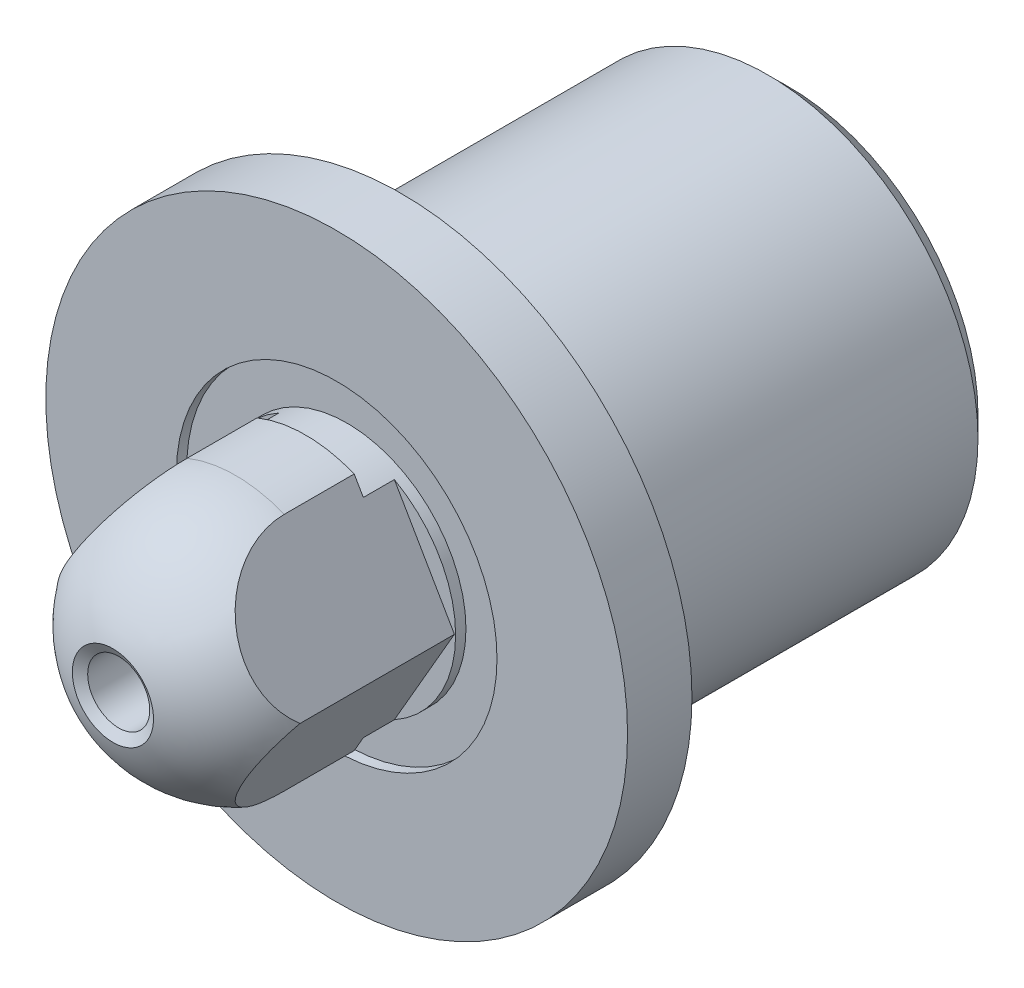
ISO-10303-21;
HEADER;
FILE_DESCRIPTION(('STEP AP214'),'2;1');
FILE_NAME('part.step','',(''),(''),'','','');
FILE_SCHEMA(('AUTOMOTIVE_DESIGN { 1 0 10303 214 1 1 1 1 }'));
ENDSEC;
DATA;
#1=APPLICATION_CONTEXT('core data for automotive mechanical design processes');
#2=APPLICATION_PROTOCOL_DEFINITION('international standard','automotive_design',2000,#1);
#3=PRODUCT_CONTEXT('',#1,'mechanical');
#4=PRODUCT('Part','Part','',(#3));
#5=PRODUCT_RELATED_PRODUCT_CATEGORY('part','',(#4));
#6=PRODUCT_DEFINITION_FORMATION('','',#4);
#7=PRODUCT_DEFINITION_CONTEXT('part definition',#1,'design');
#8=PRODUCT_DEFINITION('design','',#6,#7);
#9=PRODUCT_DEFINITION_SHAPE('','',#8);
#10=(LENGTH_UNIT() NAMED_UNIT(*) SI_UNIT(.MILLI.,.METRE.));
#11=(NAMED_UNIT(*) PLANE_ANGLE_UNIT() SI_UNIT($,.RADIAN.));
#12=(NAMED_UNIT(*) SI_UNIT($,.STERADIAN.) SOLID_ANGLE_UNIT());
#13=UNCERTAINTY_MEASURE_WITH_UNIT(LENGTH_MEASURE(1.E-05),#10,'distance_accuracy_value','');
#14=(GEOMETRIC_REPRESENTATION_CONTEXT(3) GLOBAL_UNCERTAINTY_ASSIGNED_CONTEXT((#13)) GLOBAL_UNIT_ASSIGNED_CONTEXT((#10,
#11,#12)) REPRESENTATION_CONTEXT('',''));
#15=CARTESIAN_POINT('',(0.,0.,0.));
#16=DIRECTION('',(0.,0.,1.));
#17=DIRECTION('',(1.,0.,0.));
#18=AXIS2_PLACEMENT_3D('',#15,#16,#17);
#19=CARTESIAN_POINT('',(0.,0.,13.586546080724));
#20=DIRECTION('',(0.,0.,1.));
#21=DIRECTION('',(0.,1.,0.));
#22=AXIS2_PLACEMENT_3D('',#19,#20,#21);
#23=SPHERICAL_SURFACE('',#22,3.17500000000001);
#24=CARTESIAN_POINT('',(0.,0.,16.6008963569466));
#25=DIRECTION('',(0.,0.,-1.));
#26=DIRECTION('',(-1.,0.,0.));
#27=AXIS2_PLACEMENT_3D('',#24,#25,#26);
#28=CIRCLE('',#27,0.997154658133342);
#29=CARTESIAN_POINT('',(-0.997154658133342,0.,16.6008963569466));
#30=VERTEX_POINT('',#29);
#31=EDGE_CURVE('E229',#30,#30,#28,.T.);
#32=ORIENTED_EDGE('',*,*,#31,.T.);
#33=EDGE_LOOP('',(#32));
#34=FACE_BOUND('',#33,.T.);
#35=CARTESIAN_POINT('',(-2.1685653285078,-1.25202177616928,13.586546080724));
#36=DIRECTION('',(-0.866025403784436,-0.500000000000004,0.));
#37=DIRECTION('',(0.500000000000004,-0.866025403784436,0.));
#38=AXIS2_PLACEMENT_3D('',#35,#36,#37);
#39=CIRCLE('',#38,1.95202225601857);
#40=CARTESIAN_POINT('',(-1.19255420049851,-2.94252263863396,13.586546080724));
#41=VERTEX_POINT('',#40);
#42=CARTESIAN_POINT('',(-2.89142043801042,0.,14.8981530533556));
#43=VERTEX_POINT('',#42);
#44=EDGE_CURVE('E134',#41,#43,#39,.T.);
#45=ORIENTED_EDGE('',*,*,#44,.F.);
#46=CARTESIAN_POINT('',(0.,0.,13.586546080724));
#47=DIRECTION('',(0.,0.,1.));
#48=DIRECTION('',(1.,0.,0.));
#49=AXIS2_PLACEMENT_3D('',#46,#47,#48);
#50=CIRCLE('',#49,3.175);
#51=CARTESIAN_POINT('',(1.19255420049851,-2.94252263863396,13.586546080724));
#52=VERTEX_POINT('',#51);
#53=EDGE_CURVE('E50',#41,#52,#50,.T.);
#54=ORIENTED_EDGE('',*,*,#53,.T.);
#55=CARTESIAN_POINT('',(2.1685653285078,-1.25202177616928,13.586546080724));
#56=DIRECTION('',(0.866025403784436,-0.500000000000004,0.));
#57=DIRECTION('',(0.500000000000004,0.866025403784437,0.));
#58=AXIS2_PLACEMENT_3D('',#55,#56,#57);
#59=CIRCLE('',#58,1.95202225601857);
#60=CARTESIAN_POINT('',(2.89142043801041,0.,14.8981530533556));
#61=VERTEX_POINT('',#60);
#62=EDGE_CURVE('E144',#61,#52,#59,.T.);
#63=ORIENTED_EDGE('',*,*,#62,.F.);
#64=CARTESIAN_POINT('',(2.1685653285078,1.25202177616928,13.586546080724));
#65=DIRECTION('',(0.866025403784436,0.500000000000004,0.));
#66=DIRECTION('',(-0.500000000000004,0.866025403784436,0.));
#67=AXIS2_PLACEMENT_3D('',#64,#65,#66);
#68=CIRCLE('',#67,1.95202225601857);
#69=CARTESIAN_POINT('',(1.19255420049851,2.94252263863396,13.586546080724));
#70=VERTEX_POINT('',#69);
#71=EDGE_CURVE('E153',#70,#61,#68,.T.);
#72=ORIENTED_EDGE('',*,*,#71,.F.);
#73=CARTESIAN_POINT('',(-1.19255420049851,2.94252263863396,13.586546080724));
#74=VERTEX_POINT('',#73);
#75=EDGE_CURVE('E57',#70,#74,#50,.T.);
#76=ORIENTED_EDGE('',*,*,#75,.T.);
#77=CARTESIAN_POINT('',(-2.1685653285078,1.25202177616928,13.586546080724));
#78=DIRECTION('',(-0.866025403784436,0.500000000000004,0.));
#79=DIRECTION('',(-0.500000000000004,-0.866025403784436,0.));
#80=AXIS2_PLACEMENT_3D('',#77,#78,#79);
#81=CIRCLE('',#80,1.95202225601857);
#82=EDGE_CURVE('E161',#43,#74,#81,.T.);
#83=ORIENTED_EDGE('',*,*,#82,.F.);
#84=EDGE_LOOP('',(#45,#54,#63,#72,#76,#83));
#85=FACE_BOUND('',#84,.T.);
#86=ADVANCED_FACE('F35',(#34,#85),#23,.T.);
#87=CARTESIAN_POINT('',(0.,2.921,11.86815));
#88=DIRECTION('',(0.,0.,-1.));
#89=DIRECTION('',(-1.,0.,0.));
#90=AXIS2_PLACEMENT_3D('',#87,#88,#89);
#91=PLANE('',#90);
#92=CARTESIAN_POINT('',(0.,0.,11.86815));
#93=DIRECTION('',(0.,0.,-1.));
#94=DIRECTION('',(-1.,0.,0.));
#95=AXIS2_PLACEMENT_3D('',#92,#93,#94);
#96=CIRCLE('',#95,3.175);
#97=CARTESIAN_POINT('',(1.19255420049851,-2.94252263863396,11.86815));
#98=VERTEX_POINT('',#97);
#99=CARTESIAN_POINT('',(-1.19255420049851,-2.94252263863396,11.86815));
#100=VERTEX_POINT('',#99);
#101=EDGE_CURVE('E196',#98,#100,#96,.T.);
#102=ORIENTED_EDGE('',*,*,#101,.T.);
#103=DIRECTION('',(-0.500000000000004,0.866025403784436,0.));
#104=VECTOR('',#103,1.);
#105=CARTESIAN_POINT('',(-3.43339543073498,0.938728223830708,11.86815));
#106=LINE('',#105,#104);
#107=CARTESIAN_POINT('',(-1.41656684313835,-2.554521360044,11.86815));
#108=VERTEX_POINT('',#107);
#109=EDGE_CURVE('E164',#100,#108,#106,.T.);
#110=ORIENTED_EDGE('',*,*,#109,.T.);
#111=CARTESIAN_POINT('',(0.,0.,11.86815));
#112=DIRECTION('',(0.,0.,1.));
#113=DIRECTION('',(1.,0.,0.));
#114=AXIS2_PLACEMENT_3D('',#111,#112,#113);
#115=CIRCLE('',#114,2.921);
#116=CARTESIAN_POINT('',(1.41656684313835,-2.554521360044,11.86815));
#117=VERTEX_POINT('',#116);
#118=EDGE_CURVE('E190',#108,#117,#115,.T.);
#119=ORIENTED_EDGE('',*,*,#118,.T.);
#120=DIRECTION('',(-0.500000000000004,-0.866025403784437,0.));
#121=VECTOR('',#120,1.);
#122=CARTESIAN_POINT('',(3.43339543073498,0.938728223830709,11.86815));
#123=LINE('',#122,#121);
#124=EDGE_CURVE('E141',#117,#98,#123,.T.);
#125=ORIENTED_EDGE('',*,*,#124,.T.);
#126=EDGE_LOOP('',(#102,#110,#119,#125));
#127=FACE_BOUND('',#126,.T.);
#128=ADVANCED_FACE('F247',(#127),#91,.T.);
#129=CARTESIAN_POINT('',(1.41656684313835,2.554521360044,11.86815));
#130=VERTEX_POINT('',#129);
#131=CARTESIAN_POINT('',(-1.41656684313835,2.554521360044,11.86815));
#132=VERTEX_POINT('',#131);
#133=EDGE_CURVE('E186',#130,#132,#115,.T.);
#134=ORIENTED_EDGE('',*,*,#133,.T.);
#135=DIRECTION('',(0.500000000000004,0.866025403784436,0.));
#136=VECTOR('',#135,1.);
#137=CARTESIAN_POINT('',(-0.90373522628062,3.44277177616927,11.86815));
#138=LINE('',#137,#136);
#139=CARTESIAN_POINT('',(-1.19255420049851,2.94252263863396,11.86815));
#140=VERTEX_POINT('',#139);
#141=EDGE_CURVE('E158',#132,#140,#138,.T.);
#142=ORIENTED_EDGE('',*,*,#141,.T.);
#143=CARTESIAN_POINT('',(1.19255420049851,2.94252263863396,11.86815));
#144=VERTEX_POINT('',#143);
#145=EDGE_CURVE('E205',#140,#144,#96,.T.);
#146=ORIENTED_EDGE('',*,*,#145,.T.);
#147=DIRECTION('',(0.500000000000004,-0.866025403784436,0.));
#148=VECTOR('',#147,1.);
#149=CARTESIAN_POINT('',(0.90373522628062,3.44277177616927,11.86815));
#150=LINE('',#149,#148);
#151=EDGE_CURVE('E150',#144,#130,#150,.T.);
#152=ORIENTED_EDGE('',*,*,#151,.T.);
#153=EDGE_LOOP('',(#134,#142,#146,#152));
#154=FACE_BOUND('',#153,.T.);
#155=ADVANCED_FACE('F263',(#154),#91,.T.);
#156=CARTESIAN_POINT('',(0.,0.,17.3335052900337));
#157=DIRECTION('',(0.,0.,1.));
#158=DIRECTION('',(1.,0.,0.));
#159=AXIS2_PLACEMENT_3D('',#156,#157,#158);
#160=CYLINDRICAL_SURFACE('',#159,2.921);
#161=CARTESIAN_POINT('',(0.,0.,10.85215));
#162=DIRECTION('',(0.,0.,1.));
#163=DIRECTION('',(1.,0.,0.));
#164=AXIS2_PLACEMENT_3D('',#161,#162,#163);
#165=CIRCLE('',#164,2.921);
#166=CARTESIAN_POINT('',(2.921,0.,10.85215));
#167=VERTEX_POINT('',#166);
#168=EDGE_CURVE('E189',#167,#167,#165,.T.);
#169=ORIENTED_EDGE('',*,*,#168,.T.);
#170=EDGE_LOOP('',(#169));
#171=FACE_BOUND('',#170,.T.);
#172=ORIENTED_EDGE('',*,*,#133,.F.);
#173=DIRECTION('',(0.,0.,1.));
#174=VECTOR('',#173,1.);
#175=CARTESIAN_POINT('',(1.41656684313835,2.554521360044,17.3335052900337));
#176=LINE('',#175,#174);
#177=CARTESIAN_POINT('',(1.41656684313835,2.554521360044,11.10615));
#178=VERTEX_POINT('',#177);
#179=EDGE_CURVE('E155',#130,#178,#176,.F.);
#180=ORIENTED_EDGE('',*,*,#179,.T.);
#181=CARTESIAN_POINT('',(0.,0.,11.10615));
#182=DIRECTION('',(0.,0.,-1.));
#183=DIRECTION('',(-1.,0.,0.));
#184=AXIS2_PLACEMENT_3D('',#181,#182,#183);
#185=CIRCLE('',#184,2.921);
#186=CARTESIAN_POINT('',(1.41656684313835,-2.554521360044,11.10615));
#187=VERTEX_POINT('',#186);
#188=EDGE_CURVE('E12',#187,#178,#185,.F.);
#189=ORIENTED_EDGE('',*,*,#188,.F.);
#190=DIRECTION('',(0.,0.,1.));
#191=VECTOR('',#190,1.);
#192=CARTESIAN_POINT('',(1.41656684313834,-2.554521360044,17.3335052900337));
#193=LINE('',#192,#191);
#194=EDGE_CURVE('E147',#187,#117,#193,.T.);
#195=ORIENTED_EDGE('',*,*,#194,.T.);
#196=ORIENTED_EDGE('',*,*,#118,.F.);
#197=DIRECTION('',(0.,0.,1.));
#198=VECTOR('',#197,1.);
#199=CARTESIAN_POINT('',(-1.41656684313835,-2.554521360044,17.3335052900337));
#200=LINE('',#199,#198);
#201=CARTESIAN_POINT('',(-1.41656684313835,-2.554521360044,11.10615));
#202=VERTEX_POINT('',#201);
#203=EDGE_CURVE('E168',#108,#202,#200,.F.);
#204=ORIENTED_EDGE('',*,*,#203,.T.);
#205=CARTESIAN_POINT('',(-1.41656684313835,2.554521360044,11.10615));
#206=VERTEX_POINT('',#205);
#207=EDGE_CURVE('E39',#206,#202,#185,.F.);
#208=ORIENTED_EDGE('',*,*,#207,.F.);
#209=DIRECTION('',(0.,0.,1.));
#210=VECTOR('',#209,1.);
#211=CARTESIAN_POINT('',(-1.41656684313834,2.554521360044,17.3335052900337));
#212=LINE('',#211,#210);
#213=EDGE_CURVE('E120',#206,#132,#212,.T.);
#214=ORIENTED_EDGE('',*,*,#213,.T.);
#215=EDGE_LOOP('',(#172,#180,#189,#195,#196,#204,#208,#214));
#216=FACE_BOUND('',#215,.T.);
#217=ADVANCED_FACE('F251',(#171,#216),#160,.T.);
#218=CARTESIAN_POINT('',(0.,0.,17.3335052900337));
#219=DIRECTION('',(0.,0.,1.));
#220=DIRECTION('',(1.,0.,0.));
#221=AXIS2_PLACEMENT_3D('',#218,#219,#220);
#222=CYLINDRICAL_SURFACE('',#221,3.175);
#223=DIRECTION('',(0.,0.,1.));
#224=VECTOR('',#223,1.);
#225=CARTESIAN_POINT('',(1.19255420049851,2.94252263863396,17.3335052900337));
#226=LINE('',#225,#224);
#227=EDGE_CURVE('E234',#144,#70,#226,.T.);
#228=ORIENTED_EDGE('',*,*,#227,.F.);
#229=ORIENTED_EDGE('',*,*,#145,.F.);
#230=DIRECTION('',(0.,0.,1.));
#231=VECTOR('',#230,1.);
#232=CARTESIAN_POINT('',(-1.19255420049851,2.94252263863396,17.3335052900337));
#233=LINE('',#232,#231);
#234=EDGE_CURVE('E236',#74,#140,#233,.F.);
#235=ORIENTED_EDGE('',*,*,#234,.F.);
#236=ORIENTED_EDGE('',*,*,#75,.F.);
#237=EDGE_LOOP('',(#228,#229,#235,#236));
#238=FACE_BOUND('',#237,.T.);
#239=ADVANCED_FACE('F267',(#238),#222,.T.);
#240=DIRECTION('',(0.,0.,1.));
#241=VECTOR('',#240,1.);
#242=CARTESIAN_POINT('',(1.19255420049851,-2.94252263863396,17.3335052900337));
#243=LINE('',#242,#241);
#244=EDGE_CURVE('E232',#52,#98,#243,.F.);
#245=ORIENTED_EDGE('',*,*,#244,.F.);
#246=ORIENTED_EDGE('',*,*,#53,.F.);
#247=DIRECTION('',(0.,0.,1.));
#248=VECTOR('',#247,1.);
#249=CARTESIAN_POINT('',(-1.19255420049851,-2.94252263863396,17.3335052900337));
#250=LINE('',#249,#248);
#251=EDGE_CURVE('E237',#100,#41,#250,.T.);
#252=ORIENTED_EDGE('',*,*,#251,.F.);
#253=ORIENTED_EDGE('',*,*,#101,.F.);
#254=EDGE_LOOP('',(#245,#246,#252,#253));
#255=FACE_BOUND('',#254,.T.);
#256=ADVANCED_FACE('F242',(#255),#222,.T.);
#257=CARTESIAN_POINT('',(0.,5.159375,9.525));
#258=DIRECTION('',(0.,0.,1.));
#259=DIRECTION('',(1.,0.,0.));
#260=AXIS2_PLACEMENT_3D('',#257,#258,#259);
#261=PLANE('',#260);
#262=CARTESIAN_POINT('',(0.,0.,9.525));
#263=DIRECTION('',(0.,0.,1.));
#264=DIRECTION('',(1.,0.,0.));
#265=AXIS2_PLACEMENT_3D('',#262,#263,#264);
#266=CIRCLE('',#265,7.14375);
#267=CARTESIAN_POINT('',(7.14375,0.,9.525));
#268=VERTEX_POINT('',#267);
#269=EDGE_CURVE('E201',#268,#268,#266,.T.);
#270=ORIENTED_EDGE('',*,*,#269,.F.);
#271=EDGE_LOOP('',(#270));
#272=FACE_BOUND('',#271,.T.);
#273=CARTESIAN_POINT('',(0.,0.,9.525));
#274=DIRECTION('',(0.,0.,1.));
#275=DIRECTION('',(1.,0.,0.));
#276=AXIS2_PLACEMENT_3D('',#273,#274,#275);
#277=CIRCLE('',#276,5.921375);
#278=CARTESIAN_POINT('',(5.921375,0.,9.525));
#279=VERTEX_POINT('',#278);
#280=EDGE_CURVE('E185',#279,#279,#277,.F.);
#281=ORIENTED_EDGE('',*,*,#280,.F.);
#282=EDGE_LOOP('',(#281));
#283=FACE_BOUND('',#282,.T.);
#284=ADVANCED_FACE('F275',(#272,#283),#261,.F.);
#285=CARTESIAN_POINT('',(0.,7.14375,11.10615));
#286=DIRECTION('',(0.,0.,-1.));
#287=DIRECTION('',(-1.,0.,0.));
#288=AXIS2_PLACEMENT_3D('',#285,#286,#287);
#289=PLANE('',#288);
#290=CARTESIAN_POINT('',(0.,0.,11.10615));
#291=DIRECTION('',(0.,0.,1.));
#292=DIRECTION('',(1.,0.,0.));
#293=AXIS2_PLACEMENT_3D('',#290,#291,#292);
#294=CIRCLE('',#293,7.14375);
#295=CARTESIAN_POINT('',(7.14375,0.,11.10615));
#296=VERTEX_POINT('',#295);
#297=EDGE_CURVE('E198',#296,#296,#294,.T.);
#298=ORIENTED_EDGE('',*,*,#297,.T.);
#299=EDGE_LOOP('',(#298));
#300=FACE_BOUND('',#299,.T.);
#301=CARTESIAN_POINT('',(0.,0.,11.10615));
#302=DIRECTION('',(0.,0.,-1.));
#303=DIRECTION('',(-1.,0.,0.));
#304=AXIS2_PLACEMENT_3D('',#301,#302,#303);
#305=CIRCLE('',#304,3.937);
#306=CARTESIAN_POINT('',(-3.937,0.,11.10615));
#307=VERTEX_POINT('',#306);
#308=EDGE_CURVE('E207',#307,#307,#305,.F.);
#309=ORIENTED_EDGE('',*,*,#308,.F.);
#310=EDGE_LOOP('',(#309));
#311=FACE_BOUND('',#310,.T.);
#312=ADVANCED_FACE('F370',(#300,#311),#289,.F.);
#313=CARTESIAN_POINT('',(0.,0.,17.3335052900337));
#314=DIRECTION('',(0.,0.,1.));
#315=DIRECTION('',(1.,0.,0.));
#316=AXIS2_PLACEMENT_3D('',#313,#314,#315);
#317=CYLINDRICAL_SURFACE('',#316,7.14375);
#318=ORIENTED_EDGE('',*,*,#297,.F.);
#319=EDGE_LOOP('',(#318));
#320=FACE_BOUND('',#319,.T.);
#321=ORIENTED_EDGE('',*,*,#269,.T.);
#322=EDGE_LOOP('',(#321));
#323=FACE_BOUND('',#322,.T.);
#324=ADVANCED_FACE('F291',(#320,#323),#317,.T.);
#325=CARTESIAN_POINT('',(0.,0.,17.3335052900337));
#326=DIRECTION('',(0.,0.,1.));
#327=DIRECTION('',(1.,0.,0.));
#328=AXIS2_PLACEMENT_3D('',#325,#326,#327);
#329=CYLINDRICAL_SURFACE('',#328,3.937);
#330=CARTESIAN_POINT('',(0.,0.,10.85215));
#331=DIRECTION('',(0.,0.,1.));
#332=DIRECTION('',(1.,0.,0.));
#333=AXIS2_PLACEMENT_3D('',#330,#331,#332);
#334=CIRCLE('',#333,3.937);
#335=CARTESIAN_POINT('',(3.937,0.,10.85215));
#336=VERTEX_POINT('',#335);
#337=EDGE_CURVE('E193',#336,#336,#334,.T.);
#338=ORIENTED_EDGE('',*,*,#337,.F.);
#339=EDGE_LOOP('',(#338));
#340=FACE_BOUND('',#339,.T.);
#341=ORIENTED_EDGE('',*,*,#308,.T.);
#342=EDGE_LOOP('',(#341));
#343=FACE_BOUND('',#342,.T.);
#344=ADVANCED_FACE('F287',(#340,#343),#329,.F.);
#345=CARTESIAN_POINT('',(0.,2.921,10.85215));
#346=DIRECTION('',(0.,0.,1.));
#347=DIRECTION('',(1.,0.,0.));
#348=AXIS2_PLACEMENT_3D('',#345,#346,#347);
#349=PLANE('',#348);
#350=ORIENTED_EDGE('',*,*,#337,.T.);
#351=EDGE_LOOP('',(#350));
#352=FACE_BOUND('',#351,.T.);
#353=ORIENTED_EDGE('',*,*,#168,.F.);
#354=EDGE_LOOP('',(#353));
#355=FACE_BOUND('',#354,.T.);
#356=ADVANCED_FACE('F290',(#352,#355),#349,.T.);
#357=CARTESIAN_POINT('',(0.,5.921375,8.763));
#358=DIRECTION('',(0.,0.,1.));
#359=DIRECTION('',(1.,0.,0.));
#360=AXIS2_PLACEMENT_3D('',#357,#358,#359);
#361=PLANE('',#360);
#362=CARTESIAN_POINT('',(0.,0.,8.763));
#363=DIRECTION('',(0.,0.,1.));
#364=DIRECTION('',(1.,0.,0.));
#365=AXIS2_PLACEMENT_3D('',#362,#363,#364);
#366=CIRCLE('',#365,4.905375);
#367=CARTESIAN_POINT('',(4.905375,0.,8.763));
#368=VERTEX_POINT('',#367);
#369=EDGE_CURVE('E179',#368,#368,#366,.T.);
#370=ORIENTED_EDGE('',*,*,#369,.F.);
#371=EDGE_LOOP('',(#370));
#372=FACE_BOUND('',#371,.T.);
#373=CARTESIAN_POINT('',(0.,0.,8.763));
#374=DIRECTION('',(0.,0.,1.));
#375=DIRECTION('',(1.,0.,0.));
#376=AXIS2_PLACEMENT_3D('',#373,#374,#375);
#377=CIRCLE('',#376,5.159375);
#378=CARTESIAN_POINT('',(5.159375,0.,8.763));
#379=VERTEX_POINT('',#378);
#380=EDGE_CURVE('E212',#379,#379,#377,.T.);
#381=ORIENTED_EDGE('',*,*,#380,.T.);
#382=EDGE_LOOP('',(#381));
#383=FACE_BOUND('',#382,.T.);
#384=ADVANCED_FACE('F294',(#372,#383),#361,.T.);
#385=CARTESIAN_POINT('',(0.,0.,17.3335052900337));
#386=DIRECTION('',(0.,0.,1.));
#387=DIRECTION('',(1.,0.,0.));
#388=AXIS2_PLACEMENT_3D('',#385,#386,#387);
#389=CYLINDRICAL_SURFACE('',#388,5.921375);
#390=CARTESIAN_POINT('',(0.,0.,9.779));
#391=DIRECTION('',(0.,0.,1.));
#392=DIRECTION('',(1.,0.,0.));
#393=AXIS2_PLACEMENT_3D('',#390,#391,#392);
#394=CIRCLE('',#393,5.921375);
#395=CARTESIAN_POINT('',(5.921375,0.,9.779));
#396=VERTEX_POINT('',#395);
#397=EDGE_CURVE('E176',#396,#396,#394,.T.);
#398=ORIENTED_EDGE('',*,*,#397,.T.);
#399=EDGE_LOOP('',(#398));
#400=FACE_BOUND('',#399,.T.);
#401=ORIENTED_EDGE('',*,*,#280,.T.);
#402=EDGE_LOOP('',(#401));
#403=FACE_BOUND('',#402,.T.);
#404=ADVANCED_FACE('F301',(#400,#403),#389,.F.);
#405=CARTESIAN_POINT('',(0.,5.921375,9.779));
#406=DIRECTION('',(0.,0.,-1.));
#407=DIRECTION('',(-1.,0.,0.));
#408=AXIS2_PLACEMENT_3D('',#405,#406,#407);
#409=PLANE('',#408);
#410=CARTESIAN_POINT('',(0.,0.,9.779));
#411=DIRECTION('',(0.,0.,1.));
#412=DIRECTION('',(1.,0.,0.));
#413=AXIS2_PLACEMENT_3D('',#410,#411,#412);
#414=CIRCLE('',#413,4.905375);
#415=CARTESIAN_POINT('',(4.905375,0.,9.779));
#416=VERTEX_POINT('',#415);
#417=EDGE_CURVE('E182',#416,#416,#414,.T.);
#418=ORIENTED_EDGE('',*,*,#417,.T.);
#419=EDGE_LOOP('',(#418));
#420=FACE_BOUND('',#419,.T.);
#421=ORIENTED_EDGE('',*,*,#397,.F.);
#422=EDGE_LOOP('',(#421));
#423=FACE_BOUND('',#422,.T.);
#424=ADVANCED_FACE('F297',(#420,#423),#409,.T.);
#425=CARTESIAN_POINT('',(0.,0.,17.3335052900337));
#426=DIRECTION('',(0.,0.,1.));
#427=DIRECTION('',(1.,0.,0.));
#428=AXIS2_PLACEMENT_3D('',#425,#426,#427);
#429=CYLINDRICAL_SURFACE('',#428,4.905375);
#430=ORIENTED_EDGE('',*,*,#369,.T.);
#431=EDGE_LOOP('',(#430));
#432=FACE_BOUND('',#431,.T.);
#433=ORIENTED_EDGE('',*,*,#417,.F.);
#434=EDGE_LOOP('',(#433));
#435=FACE_BOUND('',#434,.T.);
#436=ADVANCED_FACE('F300',(#432,#435),#429,.T.);
#437=CARTESIAN_POINT('',(0.,0.,0.));
#438=DIRECTION('',(0.,0.,1.));
#439=DIRECTION('',(1.,0.,0.));
#440=AXIS2_PLACEMENT_3D('',#437,#438,#439);
#441=PLANE('',#440);
#442=CARTESIAN_POINT('',(0.,0.,0.));
#443=DIRECTION('',(0.,0.,1.));
#444=DIRECTION('',(1.,0.,0.));
#445=AXIS2_PLACEMENT_3D('',#442,#443,#444);
#446=CIRCLE('',#445,1.016);
#447=CARTESIAN_POINT('',(-1.016,0.,0.));
#448=VERTEX_POINT('',#447);
#449=EDGE_CURVE('E223',#448,#448,#446,.T.);
#450=ORIENTED_EDGE('',*,*,#449,.T.);
#451=EDGE_LOOP('',(#450));
#452=FACE_BOUND('',#451,.T.);
#453=CARTESIAN_POINT('',(0.,0.,0.));
#454=DIRECTION('',(0.,0.,1.));
#455=DIRECTION('',(1.,0.,0.));
#456=AXIS2_PLACEMENT_3D('',#453,#454,#455);
#457=CIRCLE('',#456,4.6434375);
#458=CARTESIAN_POINT('',(4.6434375,0.,0.));
#459=VERTEX_POINT('',#458);
#460=EDGE_CURVE('E217',#459,#459,#457,.F.);
#461=ORIENTED_EDGE('',*,*,#460,.T.);
#462=EDGE_LOOP('',(#461));
#463=FACE_BOUND('',#462,.T.);
#464=ADVANCED_FACE('F305',(#452,#463),#441,.F.);
#465=CARTESIAN_POINT('',(0.,0.,17.3335052900337));
#466=DIRECTION('',(0.,0.,1.));
#467=DIRECTION('',(1.,0.,0.));
#468=AXIS2_PLACEMENT_3D('',#465,#466,#467);
#469=CYLINDRICAL_SURFACE('',#468,5.159375);
#470=CARTESIAN_POINT('',(0.,0.,0.515937499999997));
#471=DIRECTION('',(0.,0.,1.));
#472=DIRECTION('',(1.,0.,0.));
#473=AXIS2_PLACEMENT_3D('',#470,#471,#472);
#474=CIRCLE('',#473,5.159375);
#475=CARTESIAN_POINT('',(5.159375,0.,0.515937499999997));
#476=VERTEX_POINT('',#475);
#477=EDGE_CURVE('E204',#476,#476,#474,.T.);
#478=ORIENTED_EDGE('',*,*,#477,.T.);
#479=EDGE_LOOP('',(#478));
#480=FACE_BOUND('',#479,.T.);
#481=ORIENTED_EDGE('',*,*,#380,.F.);
#482=EDGE_LOOP('',(#481));
#483=FACE_BOUND('',#482,.T.);
#484=ADVANCED_FACE('F360',(#480,#483),#469,.T.);
#485=CARTESIAN_POINT('',(0.,0.,0.515937499999997));
#486=DIRECTION('',(0.,0.,1.));
#487=DIRECTION('',(1.,0.,0.));
#488=AXIS2_PLACEMENT_3D('',#485,#486,#487);
#489=CONICAL_SURFACE('',#488,5.159375,0.785398163397452);
#490=ORIENTED_EDGE('',*,*,#460,.F.);
#491=EDGE_LOOP('',(#490));
#492=FACE_BOUND('',#491,.T.);
#493=ORIENTED_EDGE('',*,*,#477,.F.);
#494=EDGE_LOOP('',(#493));
#495=FACE_BOUND('',#494,.T.);
#496=ADVANCED_FACE('F317',(#492,#495),#489,.T.);
#497=CARTESIAN_POINT('',(0.,0.,2.54));
#498=DIRECTION('',(0.,0.,-1.));
#499=DIRECTION('',(-1.,0.,0.));
#500=AXIS2_PLACEMENT_3D('',#497,#498,#499);
#501=CYLINDRICAL_SURFACE('',#500,0.762);
#502=CARTESIAN_POINT('',(0.,0.,0.254000000000002));
#503=DIRECTION('',(0.,0.,1.));
#504=DIRECTION('',(1.,0.,0.));
#505=AXIS2_PLACEMENT_3D('',#502,#503,#504);
#506=CIRCLE('',#505,0.762);
#507=CARTESIAN_POINT('',(-0.762,0.,0.254000000000002));
#508=VERTEX_POINT('',#507);
#509=EDGE_CURVE('E220',#508,#508,#506,.F.);
#510=ORIENTED_EDGE('',*,*,#509,.T.);
#511=EDGE_LOOP('',(#510));
#512=FACE_BOUND('',#511,.T.);
#513=CARTESIAN_POINT('',(0.,0.,2.54));
#514=DIRECTION('',(0.,0.,-1.));
#515=DIRECTION('',(-1.,0.,0.));
#516=AXIS2_PLACEMENT_3D('',#513,#514,#515);
#517=CIRCLE('',#516,0.762);
#518=CARTESIAN_POINT('',(-0.762,0.,2.54));
#519=VERTEX_POINT('',#518);
#520=EDGE_CURVE('E173',#519,#519,#517,.T.);
#521=ORIENTED_EDGE('',*,*,#520,.F.);
#522=EDGE_LOOP('',(#521));
#523=FACE_BOUND('',#522,.T.);
#524=ADVANCED_FACE('F313',(#512,#523),#501,.F.);
#525=CARTESIAN_POINT('',(0.,0.,2.54));
#526=DIRECTION('',(0.,0.,-1.));
#527=DIRECTION('',(-1.,0.,0.));
#528=AXIS2_PLACEMENT_3D('',#525,#526,#527);
#529=PLANE('',#528);
#530=ORIENTED_EDGE('',*,*,#520,.T.);
#531=EDGE_LOOP('',(#530));
#532=FACE_BOUND('',#531,.T.);
#533=ADVANCED_FACE('F316',(#532),#529,.T.);
#534=CARTESIAN_POINT('',(0.,0.,14.2215460807241));
#535=DIRECTION('',(0.,0.,1.));
#536=DIRECTION('',(1.,0.,0.));
#537=AXIS2_PLACEMENT_3D('',#534,#535,#536);
#538=CYLINDRICAL_SURFACE('',#537,0.762);
#539=CARTESIAN_POINT('',(0.,0.,16.4589666438268));
#540=DIRECTION('',(0.,0.,-1.));
#541=DIRECTION('',(-1.,0.,0.));
#542=AXIS2_PLACEMENT_3D('',#539,#540,#541);
#543=CIRCLE('',#542,0.762);
#544=CARTESIAN_POINT('',(-0.762,0.,16.4589666438268));
#545=VERTEX_POINT('',#544);
#546=EDGE_CURVE('E226',#545,#545,#543,.F.);
#547=ORIENTED_EDGE('',*,*,#546,.T.);
#548=EDGE_LOOP('',(#547));
#549=FACE_BOUND('',#548,.T.);
#550=CARTESIAN_POINT('',(0.,0.,14.2215460807241));
#551=DIRECTION('',(0.,0.,-1.));
#552=DIRECTION('',(-1.,0.,0.));
#553=AXIS2_PLACEMENT_3D('',#550,#551,#552);
#554=CIRCLE('',#553,0.762);
#555=CARTESIAN_POINT('',(-0.762,0.,14.2215460807241));
#556=VERTEX_POINT('',#555);
#557=EDGE_CURVE('E170',#556,#556,#554,.T.);
#558=ORIENTED_EDGE('',*,*,#557,.T.);
#559=EDGE_LOOP('',(#558));
#560=FACE_BOUND('',#559,.T.);
#561=ADVANCED_FACE('F321',(#549,#560),#538,.F.);
#562=CARTESIAN_POINT('',(0.,0.,14.2215460807241));
#563=DIRECTION('',(0.,0.,1.));
#564=DIRECTION('',(-1.,0.,0.));
#565=AXIS2_PLACEMENT_3D('',#562,#563,#564);
#566=PLANE('',#565);
#567=ORIENTED_EDGE('',*,*,#557,.F.);
#568=EDGE_LOOP('',(#567));
#569=FACE_BOUND('',#568,.T.);
#570=ADVANCED_FACE('F325',(#569),#566,.T.);
#571=CARTESIAN_POINT('',(0.,0.,0.254000000000002));
#572=DIRECTION('',(0.,0.,-1.));
#573=DIRECTION('',(-1.,0.,0.));
#574=AXIS2_PLACEMENT_3D('',#571,#572,#573);
#575=CONICAL_SURFACE('',#574,0.762,0.785398163397443);
#576=CARTESIAN_POINT('',(-1.016,0.,0.));
#577=CARTESIAN_POINT('',(-1.01335416666667,0.,0.00264583333333329));
#578=CARTESIAN_POINT('',(-1.01070833333333,0.,0.00529166666666666));
#579=CARTESIAN_POINT('',(-1.00541666666667,0.,0.0105833333333334));
#580=CARTESIAN_POINT('',(-1.00277083333333,0.,0.0132291666666667));
#581=CARTESIAN_POINT('',(-0.997479166666666,0.,0.0185208333333334));
#582=CARTESIAN_POINT('',(-0.994833333333333,0.,0.0211666666666668));
#583=CARTESIAN_POINT('',(-0.989541666666666,0.,0.0264583333333335));
#584=CARTESIAN_POINT('',(-0.986895833333333,0.,0.0291041666666668));
#585=CARTESIAN_POINT('',(-0.981604166666666,0.,0.0343958333333335));
#586=CARTESIAN_POINT('',(-0.978958333333333,0.,0.0370416666666669));
#587=CARTESIAN_POINT('',(-0.973666666666666,0.,0.0423333333333336));
#588=CARTESIAN_POINT('',(-0.971020833333333,0.,0.044979166666667));
#589=CARTESIAN_POINT('',(-0.965729166666666,0.,0.0502708333333337));
#590=CARTESIAN_POINT('',(-0.963083333333333,0.,0.052916666666667));
#591=CARTESIAN_POINT('',(-0.957791666666666,0.,0.0582083333333337));
#592=CARTESIAN_POINT('',(-0.955145833333333,0.,0.0608541666666671));
#593=CARTESIAN_POINT('',(-0.949854166666666,0.,0.0661458333333338));
#594=CARTESIAN_POINT('',(-0.947208333333333,0.,0.0687916666666672));
#595=CARTESIAN_POINT('',(-0.941916666666666,0.,0.0740833333333339));
#596=CARTESIAN_POINT('',(-0.939270833333333,0.,0.0767291666666672));
#597=CARTESIAN_POINT('',(-0.933979166666666,0.,0.0820208333333339));
#598=CARTESIAN_POINT('',(-0.931333333333333,0.,0.0846666666666673));
#599=CARTESIAN_POINT('',(-0.926041666666666,0.,0.089958333333334));
#600=CARTESIAN_POINT('',(-0.923395833333333,0.,0.0926041666666674));
#601=CARTESIAN_POINT('',(-0.918104166666666,0.,0.0978958333333341));
#602=CARTESIAN_POINT('',(-0.915458333333333,0.,0.100541666666667));
#603=CARTESIAN_POINT('',(-0.910166666666666,0.,0.105833333333334));
#604=CARTESIAN_POINT('',(-0.907520833333333,0.,0.108479166666667));
#605=CARTESIAN_POINT('',(-0.902229166666667,0.,0.113770833333334));
#606=CARTESIAN_POINT('',(-0.899583333333333,0.,0.116416666666668));
#607=CARTESIAN_POINT('',(-0.894291666666666,0.,0.121708333333334));
#608=CARTESIAN_POINT('',(-0.891645833333333,0.,0.124354166666668));
#609=CARTESIAN_POINT('',(-0.886354166666666,0.,0.129645833333334));
#610=CARTESIAN_POINT('',(-0.883708333333333,0.,0.132291666666668));
#611=CARTESIAN_POINT('',(-0.878416666666667,0.,0.137583333333334));
#612=CARTESIAN_POINT('',(-0.875770833333333,0.,0.140229166666668));
#613=CARTESIAN_POINT('',(-0.870479166666667,0.,0.145520833333334));
#614=CARTESIAN_POINT('',(-0.867833333333333,0.,0.148166666666668));
#615=CARTESIAN_POINT('',(-0.862541666666667,0.,0.153458333333335));
#616=CARTESIAN_POINT('',(-0.859895833333333,0.,0.156104166666668));
#617=CARTESIAN_POINT('',(-0.854604166666667,0.,0.161395833333335));
#618=CARTESIAN_POINT('',(-0.851958333333333,0.,0.164041666666668));
#619=CARTESIAN_POINT('',(-0.846666666666667,0.,0.169333333333335));
#620=CARTESIAN_POINT('',(-0.844020833333333,0.,0.171979166666668));
#621=CARTESIAN_POINT('',(-0.838729166666667,0.,0.177270833333335));
#622=CARTESIAN_POINT('',(-0.836083333333333,0.,0.179916666666668));
#623=CARTESIAN_POINT('',(-0.830791666666667,0.,0.185208333333335));
#624=CARTESIAN_POINT('',(-0.828145833333333,0.,0.187854166666668));
#625=CARTESIAN_POINT('',(-0.822854166666667,0.,0.193145833333335));
#626=CARTESIAN_POINT('',(-0.820208333333333,0.,0.195791666666668));
#627=CARTESIAN_POINT('',(-0.814916666666667,0.,0.201083333333335));
#628=CARTESIAN_POINT('',(-0.812270833333333,0.,0.203729166666668));
#629=CARTESIAN_POINT('',(-0.806979166666667,0.,0.209020833333335));
#630=CARTESIAN_POINT('',(-0.804333333333333,0.,0.211666666666668));
#631=CARTESIAN_POINT('',(-0.799041666666667,0.,0.216958333333335));
#632=CARTESIAN_POINT('',(-0.796395833333333,0.,0.219604166666668));
#633=CARTESIAN_POINT('',(-0.791104166666667,0.,0.224895833333335));
#634=CARTESIAN_POINT('',(-0.788458333333333,0.,0.227541666666668));
#635=CARTESIAN_POINT('',(-0.783166666666667,0.,0.232833333333335));
#636=CARTESIAN_POINT('',(-0.780520833333333,0.,0.235479166666669));
#637=CARTESIAN_POINT('',(-0.775229166666667,0.,0.240770833333335));
#638=CARTESIAN_POINT('',(-0.772583333333333,0.,0.243416666666669));
#639=CARTESIAN_POINT('',(-0.767291666666667,0.,0.248708333333335));
#640=CARTESIAN_POINT('',(-0.764645833333333,0.,0.251354166666669));
#641=CARTESIAN_POINT('',(-0.762,0.,0.254000000000002));
#642=B_SPLINE_CURVE_WITH_KNOTS('',3,(#576,#577,#578,#579,#580,#581,#582,#583,#584,#585,#586,
#587,#588,#589,#590,#591,#592,#593,#594,#595,#596,#597,#598,#599,#600,#601,#602,#603,#604,#605,
#606,#607,#608,#609,#610,#611,#612,#613,#614,#615,#616,#617,#618,#619,#620,#621,#622,#623,#624,
#625,#626,#627,#628,#629,#630,#631,#632,#633,#634,#635,#636,#637,#638,#639,#640,#641),
.UNSPECIFIED.,.F.,.F.,(4,2,2,2,2,2,2,2,2,2,2,2,2,2,2,2,2,2,2,2,2,2,2,2,2,2,2,2,2,2,2,2,4),(0.,
0.0112253201513364,0.0224506403026728,0.0336759604540094,0.0449012806053458,0.0561266007566823,
0.0673519209080188,0.0785772410593553,0.0898025612106917,0.101027881362028,0.112253201513365,
0.123478521664701,0.134703841816038,0.145929161967374,0.157154482118711,0.168379802270047,
0.179605122421384,0.19083044257272,0.202055762724057,0.213281082875393,0.224506403026729,
0.235731723178066,0.246957043329402,0.258182363480739,0.269407683632075,0.280633003783412,
0.291858323934748,0.303083644086085,0.314308964237421,0.325534284388758,0.336759604540094,
0.347984924691431,0.359210244842767),.UNSPECIFIED.);
#643=EDGE_CURVE('BSEAM329',#448,#508,#642,.T.);
#644=ORIENTED_EDGE('',*,*,#449,.F.);
#645=ORIENTED_EDGE('',*,*,#509,.F.);
#646=ORIENTED_EDGE('',*,*,#643,.T.);
#647=ORIENTED_EDGE('',*,*,#643,.F.);
#648=EDGE_LOOP('',(#644,#646,#645,#647));
#649=FACE_BOUND('',#648,.T.);
#650=ADVANCED_FACE('F329',(#649),#575,.F.);
#651=CARTESIAN_POINT('',(0.,0.,16.4589666438268));
#652=DIRECTION('',(0.,0.,1.));
#653=DIRECTION('',(1.,0.,0.));
#654=AXIS2_PLACEMENT_3D('',#651,#652,#653);
#655=CONICAL_SURFACE('',#654,0.762,1.02776401443642);
#656=ORIENTED_EDGE('',*,*,#31,.F.);
#657=EDGE_LOOP('',(#656));
#658=FACE_BOUND('',#657,.T.);
#659=ORIENTED_EDGE('',*,*,#546,.F.);
#660=EDGE_LOOP('',(#659));
#661=FACE_BOUND('',#660,.T.);
#662=ADVANCED_FACE('F37',(#658,#661),#655,.F.);
#663=CARTESIAN_POINT('',(2.89142043801042,0.,-9.30148203512965));
#664=DIRECTION('',(0.866025403784436,-0.500000000000004,0.));
#665=DIRECTION('',(0.500000000000004,0.866025403784437,0.));
#666=AXIS2_PLACEMENT_3D('',#663,#664,#665);
#667=PLANE('',#666);
#668=DIRECTION('',(0.500000000000004,0.866025403784437,0.));
#669=VECTOR('',#668,1.);
#670=CARTESIAN_POINT('',(2.89142043801042,0.,11.10615));
#671=LINE('',#670,#669);
#672=CARTESIAN_POINT('',(2.89142043801042,0.,11.10615));
#673=VERTEX_POINT('',#672);
#674=EDGE_CURVE('E130',#187,#673,#671,.T.);
#675=ORIENTED_EDGE('',*,*,#674,.T.);
#676=DIRECTION('',(0.,0.,1.));
#677=VECTOR('',#676,1.);
#678=CARTESIAN_POINT('',(2.89142043801042,0.,-9.30148203512965));
#679=LINE('',#678,#677);
#680=EDGE_CURVE('E124',#673,#61,#679,.T.);
#681=ORIENTED_EDGE('',*,*,#680,.T.);
#682=ORIENTED_EDGE('',*,*,#62,.T.);
#683=ORIENTED_EDGE('',*,*,#244,.T.);
#684=ORIENTED_EDGE('',*,*,#124,.F.);
#685=ORIENTED_EDGE('',*,*,#194,.F.);
#686=EDGE_LOOP('',(#675,#681,#682,#683,#684,#685));
#687=FACE_BOUND('',#686,.T.);
#688=ADVANCED_FACE('F244',(#687),#667,.T.);
#689=CARTESIAN_POINT('',(1.05833333333333,3.175,-9.30148203512965));
#690=DIRECTION('',(0.866025403784436,0.500000000000004,0.));
#691=DIRECTION('',(-0.500000000000004,0.866025403784436,0.));
#692=AXIS2_PLACEMENT_3D('',#689,#690,#691);
#693=PLANE('',#692);
#694=ORIENTED_EDGE('',*,*,#151,.F.);
#695=ORIENTED_EDGE('',*,*,#227,.T.);
#696=ORIENTED_EDGE('',*,*,#71,.T.);
#697=ORIENTED_EDGE('',*,*,#680,.F.);
#698=DIRECTION('',(-0.500000000000004,0.866025403784436,0.));
#699=VECTOR('',#698,1.);
#700=CARTESIAN_POINT('',(1.05833333333333,3.175,11.10615));
#701=LINE('',#700,#699);
#702=EDGE_CURVE('E145',#673,#178,#701,.T.);
#703=ORIENTED_EDGE('',*,*,#702,.T.);
#704=ORIENTED_EDGE('',*,*,#179,.F.);
#705=EDGE_LOOP('',(#694,#695,#696,#697,#703,#704));
#706=FACE_BOUND('',#705,.T.);
#707=ADVANCED_FACE('F261',(#706),#693,.T.);
#708=CARTESIAN_POINT('',(0.,7.14375,11.10615));
#709=DIRECTION('',(0.,0.,-1.));
#710=DIRECTION('',(-1.,0.,0.));
#711=AXIS2_PLACEMENT_3D('',#708,#709,#710);
#712=PLANE('',#711);
#713=ORIENTED_EDGE('',*,*,#188,.T.);
#714=ORIENTED_EDGE('',*,*,#702,.F.);
#715=ORIENTED_EDGE('',*,*,#674,.F.);
#716=EDGE_LOOP('',(#713,#714,#715));
#717=FACE_BOUND('',#716,.T.);
#718=ADVANCED_FACE('F256',(#717),#712,.F.);
#719=CARTESIAN_POINT('',(-1.05833333333333,-3.175,-9.30148203512965));
#720=DIRECTION('',(-0.866025403784436,-0.500000000000004,0.));
#721=DIRECTION('',(0.500000000000004,-0.866025403784436,0.));
#722=AXIS2_PLACEMENT_3D('',#719,#720,#721);
#723=PLANE('',#722);
#724=ORIENTED_EDGE('',*,*,#109,.F.);
#725=ORIENTED_EDGE('',*,*,#251,.T.);
#726=ORIENTED_EDGE('',*,*,#44,.T.);
#727=DIRECTION('',(0.,0.,1.));
#728=VECTOR('',#727,1.);
#729=CARTESIAN_POINT('',(-2.89142043801042,0.,-9.30148203512965));
#730=LINE('',#729,#728);
#731=CARTESIAN_POINT('',(-2.89142043801042,0.,11.10615));
#732=VERTEX_POINT('',#731);
#733=EDGE_CURVE('E118',#732,#43,#730,.T.);
#734=ORIENTED_EDGE('',*,*,#733,.F.);
#735=DIRECTION('',(0.500000000000004,-0.866025403784436,0.));
#736=VECTOR('',#735,1.);
#737=CARTESIAN_POINT('',(-1.05833333333333,-3.175,11.10615));
#738=LINE('',#737,#736);
#739=EDGE_CURVE('E123',#732,#202,#738,.T.);
#740=ORIENTED_EDGE('',*,*,#739,.T.);
#741=ORIENTED_EDGE('',*,*,#203,.F.);
#742=EDGE_LOOP('',(#724,#725,#726,#734,#740,#741));
#743=FACE_BOUND('',#742,.T.);
#744=ADVANCED_FACE('F133',(#743),#723,.T.);
#745=CARTESIAN_POINT('',(-2.89142043801042,0.,-9.30148203512965));
#746=DIRECTION('',(-0.866025403784436,0.500000000000004,0.));
#747=DIRECTION('',(-0.500000000000004,-0.866025403784436,0.));
#748=AXIS2_PLACEMENT_3D('',#745,#746,#747);
#749=PLANE('',#748);
#750=DIRECTION('',(-0.500000000000004,-0.866025403784436,0.));
#751=VECTOR('',#750,1.);
#752=CARTESIAN_POINT('',(-2.89142043801042,0.,11.10615));
#753=LINE('',#752,#751);
#754=EDGE_CURVE('E114',#206,#732,#753,.T.);
#755=ORIENTED_EDGE('',*,*,#754,.T.);
#756=ORIENTED_EDGE('',*,*,#733,.T.);
#757=ORIENTED_EDGE('',*,*,#82,.T.);
#758=ORIENTED_EDGE('',*,*,#234,.T.);
#759=ORIENTED_EDGE('',*,*,#141,.F.);
#760=ORIENTED_EDGE('',*,*,#213,.F.);
#761=EDGE_LOOP('',(#755,#756,#757,#758,#759,#760));
#762=FACE_BOUND('',#761,.T.);
#763=ADVANCED_FACE('F116',(#762),#749,.T.);
#764=ORIENTED_EDGE('',*,*,#207,.T.);
#765=ORIENTED_EDGE('',*,*,#739,.F.);
#766=ORIENTED_EDGE('',*,*,#754,.F.);
#767=EDGE_LOOP('',(#764,#765,#766));
#768=FACE_BOUND('',#767,.T.);
#769=ADVANCED_FACE('F127',(#768),#712,.F.);
#770=CLOSED_SHELL('',(#86,#128,#155,#217,#239,#256,#284,#312,#324,#344,#356,#384,#404,#424,#436,
#464,#484,#496,#524,#533,#561,#570,#650,#662,#688,#707,#718,#744,#763,#769));
#771=MANIFOLD_SOLID_BREP('B2',#770);
#772=ADVANCED_BREP_SHAPE_REPRESENTATION('',(#18,#771),#14);
#773=SHAPE_DEFINITION_REPRESENTATION(#9,#772);
ENDSEC;
END-ISO-10303-21;
